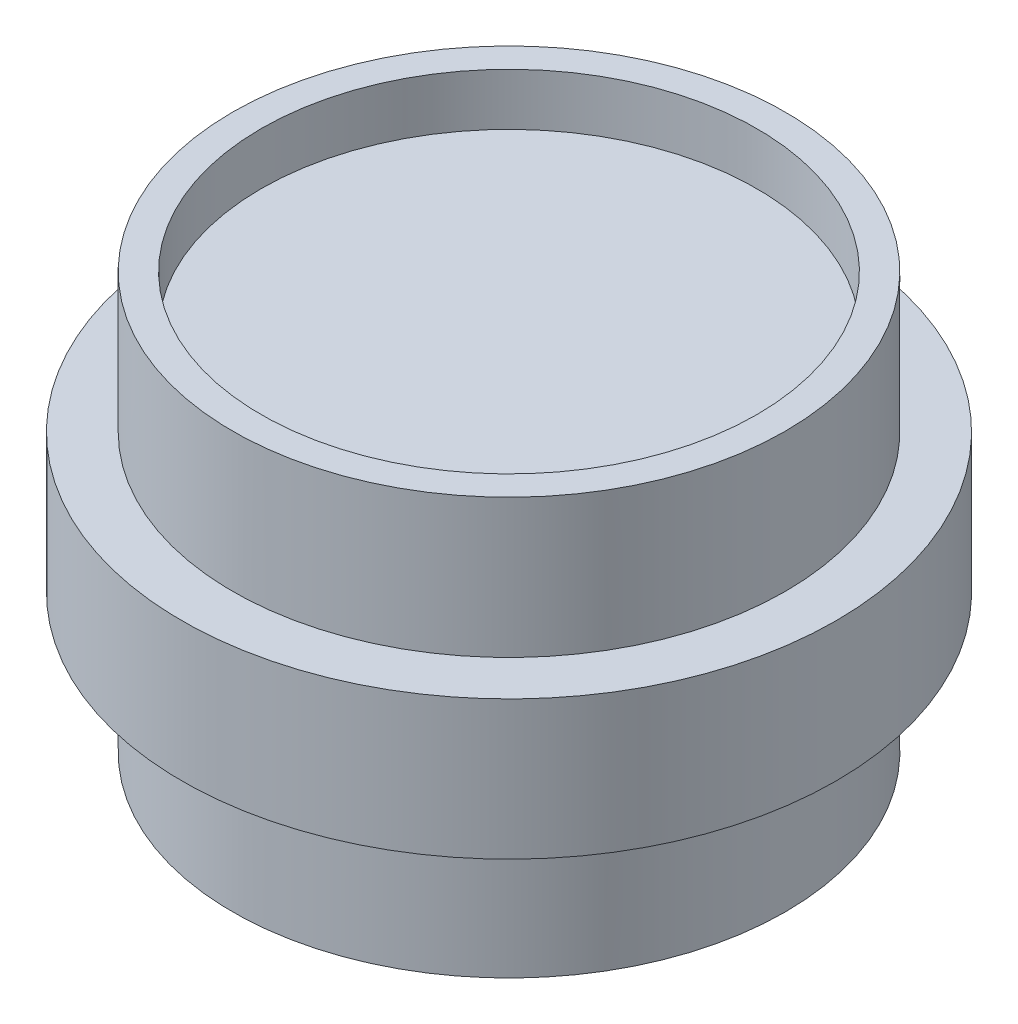
ISO-10303-21;
HEADER;
FILE_DESCRIPTION(('STEP AP214'),'2;1');
FILE_NAME('part.step','',(''),(''),'','','');
FILE_SCHEMA(('AUTOMOTIVE_DESIGN { 1 0 10303 214 1 1 1 1 }'));
ENDSEC;
DATA;
#1=APPLICATION_CONTEXT('core data for automotive mechanical design processes');
#2=APPLICATION_PROTOCOL_DEFINITION('international standard','automotive_design',2000,#1);
#3=PRODUCT_CONTEXT('',#1,'mechanical');
#4=PRODUCT('Part','Part','',(#3));
#5=PRODUCT_RELATED_PRODUCT_CATEGORY('part','',(#4));
#6=PRODUCT_DEFINITION_FORMATION('','',#4);
#7=PRODUCT_DEFINITION_CONTEXT('part definition',#1,'design');
#8=PRODUCT_DEFINITION('design','',#6,#7);
#9=PRODUCT_DEFINITION_SHAPE('','',#8);
#10=(LENGTH_UNIT() NAMED_UNIT(*) SI_UNIT(.MILLI.,.METRE.));
#11=(NAMED_UNIT(*) PLANE_ANGLE_UNIT() SI_UNIT($,.RADIAN.));
#12=(NAMED_UNIT(*) SI_UNIT($,.STERADIAN.) SOLID_ANGLE_UNIT());
#13=UNCERTAINTY_MEASURE_WITH_UNIT(LENGTH_MEASURE(1.E-05),#10,'distance_accuracy_value','');
#14=(GEOMETRIC_REPRESENTATION_CONTEXT(3) GLOBAL_UNCERTAINTY_ASSIGNED_CONTEXT((#13)) GLOBAL_UNIT_ASSIGNED_CONTEXT((#10,
#11,#12)) REPRESENTATION_CONTEXT('',''));
#15=CARTESIAN_POINT('',(0.,0.,0.));
#16=DIRECTION('',(0.,0.,1.));
#17=DIRECTION('',(1.,0.,0.));
#18=AXIS2_PLACEMENT_3D('',#15,#16,#17);
#19=CARTESIAN_POINT('',(0.,-25.4,0.));
#20=DIRECTION('',(0.,-1.,0.));
#21=DIRECTION('',(1.,0.,0.));
#22=AXIS2_PLACEMENT_3D('',#19,#20,#21);
#23=PLANE('',#22);
#24=CARTESIAN_POINT('',(0.,-25.4,0.));
#25=DIRECTION('',(0.,-1.,0.));
#26=DIRECTION('',(1.,0.,0.));
#27=AXIS2_PLACEMENT_3D('',#24,#25,#26);
#28=CIRCLE('',#27,87.1674838557493);
#29=CARTESIAN_POINT('',(-78.6615462449454,-25.4,37.5570417378236));
#30=VERTEX_POINT('',#29);
#31=CARTESIAN_POINT('',(-78.6615462449454,-25.4,-37.5570417378236));
#32=VERTEX_POINT('',#31);
#33=EDGE_CURVE('E364',#30,#32,#28,.T.);
#34=ORIENTED_EDGE('',*,*,#33,.T.);
#35=DIRECTION('',(0.,0.,1.));
#36=VECTOR('',#35,1.);
#37=CARTESIAN_POINT('',(-78.6615462449454,-25.4,0.));
#38=LINE('',#37,#36);
#39=EDGE_CURVE('E405',#32,#30,#38,.T.);
#40=ORIENTED_EDGE('',*,*,#39,.T.);
#41=EDGE_LOOP('',(#34,#40));
#42=FACE_BOUND('',#41,.T.);
#43=ADVANCED_FACE('F16',(#42),#23,.T.);
#44=DIRECTION('',(0.,0.,-1.));
#45=VECTOR('',#44,1.);
#46=CARTESIAN_POINT('',(-40.3711849281472,-25.4,0.));
#47=LINE('',#46,#45);
#48=CARTESIAN_POINT('',(-40.3711849281472,-25.4,-37.5570417378236));
#49=VERTEX_POINT('',#48);
#50=CARTESIAN_POINT('',(-40.3711849281471,-25.4,-77.2550171137102));
#51=VERTEX_POINT('',#50);
#52=EDGE_CURVE('E393',#49,#51,#47,.T.);
#53=ORIENTED_EDGE('',*,*,#52,.F.);
#54=DIRECTION('',(-1.,0.,0.));
#55=VECTOR('',#54,1.);
#56=CARTESIAN_POINT('',(0.,-25.4,-37.5570417378236));
#57=LINE('',#56,#55);
#58=EDGE_CURVE('E206',#49,#32,#57,.T.);
#59=ORIENTED_EDGE('',*,*,#58,.T.);
#60=EDGE_CURVE('E371',#32,#51,#28,.T.);
#61=ORIENTED_EDGE('',*,*,#60,.T.);
#62=EDGE_LOOP('',(#53,#59,#61));
#63=FACE_BOUND('',#62,.T.);
#64=ADVANCED_FACE('F308',(#63),#23,.T.);
#65=CARTESIAN_POINT('',(40.3711849281471,-25.4,-77.2550171137102));
#66=VERTEX_POINT('',#65);
#67=EDGE_CURVE('E376',#51,#66,#28,.T.);
#68=ORIENTED_EDGE('',*,*,#67,.T.);
#69=DIRECTION('',(-1.,0.,0.));
#70=VECTOR('',#69,1.);
#71=CARTESIAN_POINT('',(0.,-25.4,-77.2550171137102));
#72=LINE('',#71,#70);
#73=EDGE_CURVE('E149',#66,#51,#72,.T.);
#74=ORIENTED_EDGE('',*,*,#73,.T.);
#75=EDGE_LOOP('',(#68,#74));
#76=FACE_BOUND('',#75,.T.);
#77=ADVANCED_FACE('F315',(#76),#23,.T.);
#78=CARTESIAN_POINT('',(78.6615462449454,-25.4,-37.5570417378236));
#79=VERTEX_POINT('',#78);
#80=CARTESIAN_POINT('',(40.3711849281472,-25.4,-37.5570417378236));
#81=VERTEX_POINT('',#80);
#82=EDGE_CURVE('E195',#79,#81,#57,.T.);
#83=ORIENTED_EDGE('',*,*,#82,.T.);
#84=DIRECTION('',(0.,0.,-1.));
#85=VECTOR('',#84,1.);
#86=CARTESIAN_POINT('',(40.3711849281472,-25.4,0.));
#87=LINE('',#86,#85);
#88=EDGE_CURVE('E345',#81,#66,#87,.T.);
#89=ORIENTED_EDGE('',*,*,#88,.T.);
#90=EDGE_CURVE('E352',#66,#79,#28,.T.);
#91=ORIENTED_EDGE('',*,*,#90,.T.);
#92=EDGE_LOOP('',(#83,#89,#91));
#93=FACE_BOUND('',#92,.T.);
#94=ADVANCED_FACE('F388',(#93),#23,.T.);
#95=CARTESIAN_POINT('',(-40.3711849281471,-25.4,77.2550171137102));
#96=VERTEX_POINT('',#95);
#97=CARTESIAN_POINT('',(-40.3711849281472,-25.4,37.5570417378236));
#98=VERTEX_POINT('',#97);
#99=EDGE_CURVE('E399',#96,#98,#47,.T.);
#100=ORIENTED_EDGE('',*,*,#99,.F.);
#101=EDGE_CURVE('E359',#96,#30,#28,.T.);
#102=ORIENTED_EDGE('',*,*,#101,.T.);
#103=DIRECTION('',(-1.,0.,0.));
#104=VECTOR('',#103,1.);
#105=CARTESIAN_POINT('',(0.,-25.4,37.5570417378236));
#106=LINE('',#105,#104);
#107=EDGE_CURVE('E347',#98,#30,#106,.T.);
#108=ORIENTED_EDGE('',*,*,#107,.F.);
#109=EDGE_LOOP('',(#100,#102,#108));
#110=FACE_BOUND('',#109,.T.);
#111=ADVANCED_FACE('F340',(#110),#23,.T.);
#112=DIRECTION('',(0.,0.,1.));
#113=VECTOR('',#112,1.);
#114=CARTESIAN_POINT('',(78.6615462449454,-25.4,0.));
#115=LINE('',#114,#113);
#116=CARTESIAN_POINT('',(78.6615462449454,-25.4,37.5570417378236));
#117=VERTEX_POINT('',#116);
#118=EDGE_CURVE('E187',#79,#117,#115,.T.);
#119=ORIENTED_EDGE('',*,*,#118,.F.);
#120=EDGE_CURVE('E255',#79,#117,#28,.T.);
#121=ORIENTED_EDGE('',*,*,#120,.T.);
#122=EDGE_LOOP('',(#119,#121));
#123=FACE_BOUND('',#122,.T.);
#124=ADVANCED_FACE('F334',(#123),#23,.T.);
#125=CARTESIAN_POINT('',(40.3711849281472,-25.4,37.5570417378236));
#126=VERTEX_POINT('',#125);
#127=EDGE_CURVE('E204',#117,#126,#106,.T.);
#128=ORIENTED_EDGE('',*,*,#127,.F.);
#129=CARTESIAN_POINT('',(40.3711849281471,-25.4,77.2550171137102));
#130=VERTEX_POINT('',#129);
#131=EDGE_CURVE('E249',#117,#130,#28,.T.);
#132=ORIENTED_EDGE('',*,*,#131,.T.);
#133=EDGE_CURVE('E38',#130,#126,#87,.T.);
#134=ORIENTED_EDGE('',*,*,#133,.T.);
#135=EDGE_LOOP('',(#128,#132,#134));
#136=FACE_BOUND('',#135,.T.);
#137=ADVANCED_FACE('F324',(#136),#23,.T.);
#138=CARTESIAN_POINT('',(0.,-76.2,0.));
#139=DIRECTION('',(0.,1.,0.));
#140=DIRECTION('',(0.,0.,1.));
#141=AXIS2_PLACEMENT_3D('',#138,#139,#140);
#142=CYLINDRICAL_SURFACE('',#141,101.150613209662);
#143=CARTESIAN_POINT('',(0.,-25.4,0.));
#144=DIRECTION('',(0.,-1.,0.));
#145=DIRECTION('',(0.,0.,-1.));
#146=AXIS2_PLACEMENT_3D('',#143,#144,#145);
#147=CIRCLE('',#146,101.150613209662);
#148=CARTESIAN_POINT('',(0.,-25.4,-101.150613209662));
#149=VERTEX_POINT('',#148);
#150=EDGE_CURVE('E20',#149,#149,#147,.T.);
#151=ORIENTED_EDGE('',*,*,#150,.T.);
#152=EDGE_LOOP('',(#151));
#153=FACE_BOUND('',#152,.T.);
#154=CARTESIAN_POINT('',(0.,-76.2,0.));
#155=DIRECTION('',(0.,-1.,0.));
#156=DIRECTION('',(1.,0.,0.));
#157=AXIS2_PLACEMENT_3D('',#154,#155,#156);
#158=CIRCLE('',#157,101.150613209662);
#159=CARTESIAN_POINT('',(101.150613209662,-76.2,0.));
#160=VERTEX_POINT('',#159);
#161=EDGE_CURVE('E26',#160,#160,#158,.T.);
#162=ORIENTED_EDGE('',*,*,#161,.F.);
#163=EDGE_LOOP('',(#162));
#164=FACE_BOUND('',#163,.T.);
#165=ADVANCED_FACE('F18',(#153,#164),#142,.T.);
#166=CARTESIAN_POINT('',(0.,-76.2,0.));
#167=DIRECTION('',(0.,-1.,0.));
#168=DIRECTION('',(1.,0.,0.));
#169=AXIS2_PLACEMENT_3D('',#166,#167,#168);
#170=PLANE('',#169);
#171=CARTESIAN_POINT('',(0.,-76.2,0.));
#172=DIRECTION('',(0.,-1.,0.));
#173=DIRECTION('',(1.,0.,0.));
#174=AXIS2_PLACEMENT_3D('',#171,#172,#173);
#175=CIRCLE('',#174,87.1674838557493);
#176=CARTESIAN_POINT('',(87.1674838557493,-76.2,0.));
#177=VERTEX_POINT('',#176);
#178=EDGE_CURVE('E245',#177,#177,#175,.T.);
#179=ORIENTED_EDGE('',*,*,#178,.F.);
#180=EDGE_LOOP('',(#179));
#181=FACE_BOUND('',#180,.T.);
#182=ORIENTED_EDGE('',*,*,#161,.T.);
#183=EDGE_LOOP('',(#182));
#184=FACE_BOUND('',#183,.T.);
#185=ADVANCED_FACE('F293',(#181,#184),#170,.T.);
#186=CARTESIAN_POINT('',(0.,-25.4,0.));
#187=DIRECTION('',(0.,1.,0.));
#188=DIRECTION('',(0.,0.,1.));
#189=AXIS2_PLACEMENT_3D('',#186,#187,#188);
#190=CYLINDRICAL_SURFACE('',#189,119.726736982733);
#191=CARTESIAN_POINT('',(0.,-25.4,0.));
#192=DIRECTION('',(0.,-1.,0.));
#193=DIRECTION('',(1.,0.,0.));
#194=AXIS2_PLACEMENT_3D('',#191,#192,#193);
#195=CIRCLE('',#194,119.726736982733);
#196=CARTESIAN_POINT('',(119.726736982733,-25.4,0.));
#197=VERTEX_POINT('',#196);
#198=EDGE_CURVE('E259',#197,#197,#195,.T.);
#199=ORIENTED_EDGE('',*,*,#198,.F.);
#200=EDGE_LOOP('',(#199));
#201=FACE_BOUND('',#200,.T.);
#202=CARTESIAN_POINT('',(0.,25.4,0.));
#203=DIRECTION('',(0.,-1.,0.));
#204=DIRECTION('',(1.,0.,0.));
#205=AXIS2_PLACEMENT_3D('',#202,#203,#204);
#206=CIRCLE('',#205,119.726736982733);
#207=CARTESIAN_POINT('',(119.726736982733,25.4,0.));
#208=VERTEX_POINT('',#207);
#209=EDGE_CURVE('E253',#208,#208,#206,.T.);
#210=ORIENTED_EDGE('',*,*,#209,.T.);
#211=EDGE_LOOP('',(#210));
#212=FACE_BOUND('',#211,.T.);
#213=ADVANCED_FACE('F287',(#201,#212),#190,.T.);
#214=CARTESIAN_POINT('',(0.,-25.4,0.));
#215=DIRECTION('',(0.,-1.,0.));
#216=DIRECTION('',(1.,0.,0.));
#217=AXIS2_PLACEMENT_3D('',#214,#215,#216);
#218=PLANE('',#217);
#219=ORIENTED_EDGE('',*,*,#150,.F.);
#220=EDGE_LOOP('',(#219));
#221=FACE_BOUND('',#220,.T.);
#222=ORIENTED_EDGE('',*,*,#198,.T.);
#223=EDGE_LOOP('',(#222));
#224=FACE_BOUND('',#223,.T.);
#225=ADVANCED_FACE('F283',(#221,#224),#218,.T.);
#226=CARTESIAN_POINT('',(0.,25.4,0.));
#227=DIRECTION('',(0.,-1.,0.));
#228=DIRECTION('',(1.,0.,0.));
#229=AXIS2_PLACEMENT_3D('',#226,#227,#228);
#230=PLANE('',#229);
#231=CARTESIAN_POINT('',(0.,25.4,0.));
#232=DIRECTION('',(0.,-1.,0.));
#233=DIRECTION('',(0.,0.,-1.));
#234=AXIS2_PLACEMENT_3D('',#231,#232,#233);
#235=CIRCLE('',#234,101.150613209662);
#236=CARTESIAN_POINT('',(0.,25.4,-101.150613209662));
#237=VERTEX_POINT('',#236);
#238=EDGE_CURVE('E10',#237,#237,#235,.T.);
#239=ORIENTED_EDGE('',*,*,#238,.T.);
#240=EDGE_LOOP('',(#239));
#241=FACE_BOUND('',#240,.T.);
#242=ORIENTED_EDGE('',*,*,#209,.F.);
#243=EDGE_LOOP('',(#242));
#244=FACE_BOUND('',#243,.T.);
#245=ADVANCED_FACE('F286',(#241,#244),#230,.F.);
#246=CARTESIAN_POINT('',(0.,76.2,0.));
#247=DIRECTION('',(0.,-1.,0.));
#248=DIRECTION('',(1.,0.,0.));
#249=AXIS2_PLACEMENT_3D('',#246,#247,#248);
#250=PLANE('',#249);
#251=CARTESIAN_POINT('',(0.,76.2,0.));
#252=DIRECTION('',(0.,1.,0.));
#253=DIRECTION('',(-1.,0.,0.));
#254=AXIS2_PLACEMENT_3D('',#251,#252,#253);
#255=CIRCLE('',#254,90.7011360194361);
#256=CARTESIAN_POINT('',(-90.7011360194361,76.2,0.));
#257=VERTEX_POINT('',#256);
#258=EDGE_CURVE('E231',#257,#257,#255,.T.);
#259=ORIENTED_EDGE('',*,*,#258,.F.);
#260=EDGE_LOOP('',(#259));
#261=FACE_BOUND('',#260,.T.);
#262=CARTESIAN_POINT('',(0.,76.2,0.));
#263=DIRECTION('',(0.,-1.,0.));
#264=DIRECTION('',(1.,0.,0.));
#265=AXIS2_PLACEMENT_3D('',#262,#263,#264);
#266=CIRCLE('',#265,101.150613209662);
#267=CARTESIAN_POINT('',(101.150613209662,76.2,0.));
#268=VERTEX_POINT('',#267);
#269=EDGE_CURVE('E269',#268,#268,#266,.T.);
#270=ORIENTED_EDGE('',*,*,#269,.F.);
#271=EDGE_LOOP('',(#270));
#272=FACE_BOUND('',#271,.T.);
#273=ADVANCED_FACE('F298',(#261,#272),#250,.F.);
#274=ORIENTED_EDGE('',*,*,#269,.T.);
#275=EDGE_LOOP('',(#274));
#276=FACE_BOUND('',#275,.T.);
#277=ORIENTED_EDGE('',*,*,#238,.F.);
#278=EDGE_LOOP('',(#277));
#279=FACE_BOUND('',#278,.T.);
#280=ADVANCED_FACE('F305',(#276,#279),#142,.T.);
#281=CARTESIAN_POINT('',(0.,-25.4,0.));
#282=DIRECTION('',(0.,-1.,0.));
#283=DIRECTION('',(0.,0.,-1.));
#284=AXIS2_PLACEMENT_3D('',#281,#282,#283);
#285=CYLINDRICAL_SURFACE('',#284,87.1674838557493);
#286=ORIENTED_EDGE('',*,*,#131,.F.);
#287=ORIENTED_EDGE('',*,*,#120,.F.);
#288=ORIENTED_EDGE('',*,*,#90,.F.);
#289=ORIENTED_EDGE('',*,*,#67,.F.);
#290=ORIENTED_EDGE('',*,*,#60,.F.);
#291=ORIENTED_EDGE('',*,*,#33,.F.);
#292=ORIENTED_EDGE('',*,*,#101,.F.);
#293=EDGE_CURVE('E254',#130,#96,#28,.T.);
#294=ORIENTED_EDGE('',*,*,#293,.F.);
#295=EDGE_LOOP('',(#286,#287,#288,#289,#290,#291,#292,#294));
#296=FACE_BOUND('',#295,.T.);
#297=ORIENTED_EDGE('',*,*,#178,.T.);
#298=EDGE_LOOP('',(#297));
#299=FACE_BOUND('',#298,.T.);
#300=ADVANCED_FACE('F322',(#296,#299),#285,.F.);
#301=DIRECTION('',(-1.,0.,0.));
#302=VECTOR('',#301,1.);
#303=CARTESIAN_POINT('',(0.,-25.4,77.2550171137102));
#304=LINE('',#303,#302);
#305=EDGE_CURVE('E395',#130,#96,#304,.T.);
#306=ORIENTED_EDGE('',*,*,#305,.F.);
#307=ORIENTED_EDGE('',*,*,#293,.T.);
#308=EDGE_LOOP('',(#306,#307));
#309=FACE_BOUND('',#308,.T.);
#310=ADVANCED_FACE('F311',(#309),#23,.T.);
#311=CARTESIAN_POINT('',(0.,57.15,0.));
#312=DIRECTION('',(0.,1.,0.));
#313=DIRECTION('',(0.,0.,1.));
#314=AXIS2_PLACEMENT_3D('',#311,#312,#313);
#315=CYLINDRICAL_SURFACE('',#314,90.7011360194361);
#316=CARTESIAN_POINT('',(0.,57.15,0.));
#317=DIRECTION('',(0.,1.,0.));
#318=DIRECTION('',(-1.,0.,0.));
#319=AXIS2_PLACEMENT_3D('',#316,#317,#318);
#320=CIRCLE('',#319,90.7011360194361);
#321=CARTESIAN_POINT('',(-90.7011360194361,57.15,0.));
#322=VERTEX_POINT('',#321);
#323=EDGE_CURVE('E241',#322,#322,#320,.T.);
#324=ORIENTED_EDGE('',*,*,#323,.F.);
#325=EDGE_LOOP('',(#324));
#326=FACE_BOUND('',#325,.T.);
#327=ORIENTED_EDGE('',*,*,#258,.T.);
#328=EDGE_LOOP('',(#327));
#329=FACE_BOUND('',#328,.T.);
#330=ADVANCED_FACE('F321',(#326,#329),#315,.F.);
#331=CARTESIAN_POINT('',(0.,57.15,0.));
#332=DIRECTION('',(0.,1.,0.));
#333=DIRECTION('',(-1.,0.,0.));
#334=AXIS2_PLACEMENT_3D('',#331,#332,#333);
#335=PLANE('',#334);
#336=ORIENTED_EDGE('',*,*,#323,.T.);
#337=EDGE_LOOP('',(#336));
#338=FACE_BOUND('',#337,.T.);
#339=ADVANCED_FACE('F329',(#338),#335,.T.);
#340=CARTESIAN_POINT('',(-40.3711849281472,0.,0.));
#341=DIRECTION('',(-1.,0.,0.));
#342=DIRECTION('',(0.,0.,1.));
#343=AXIS2_PLACEMENT_3D('',#340,#341,#342);
#344=PLANE('',#343);
#345=ORIENTED_EDGE('',*,*,#99,.T.);
#346=DIRECTION('',(0.,-1.,0.));
#347=VECTOR('',#346,1.);
#348=CARTESIAN_POINT('',(-40.3711849281472,0.,37.5570417378236));
#349=LINE('',#348,#347);
#350=CARTESIAN_POINT('',(-40.3711849281472,0.,37.5570417378236));
#351=VERTEX_POINT('',#350);
#352=EDGE_CURVE('E226',#351,#98,#349,.T.);
#353=ORIENTED_EDGE('',*,*,#352,.F.);
#354=DIRECTION('',(0.,0.,-1.));
#355=VECTOR('',#354,1.);
#356=CARTESIAN_POINT('',(-40.3711849281472,0.,0.));
#357=LINE('',#356,#355);
#358=CARTESIAN_POINT('',(-40.3711849281471,0.,77.2550171137102));
#359=VERTEX_POINT('',#358);
#360=EDGE_CURVE('E193',#359,#351,#357,.T.);
#361=ORIENTED_EDGE('',*,*,#360,.F.);
#362=DIRECTION('',(0.,-1.,0.));
#363=VECTOR('',#362,1.);
#364=CARTESIAN_POINT('',(-40.3711849281471,0.,77.2550171137102));
#365=LINE('',#364,#363);
#366=EDGE_CURVE('E232',#359,#96,#365,.T.);
#367=ORIENTED_EDGE('',*,*,#366,.T.);
#368=EDGE_LOOP('',(#345,#353,#361,#367));
#369=FACE_BOUND('',#368,.T.);
#370=ADVANCED_FACE('F466',(#369),#344,.F.);
#371=CARTESIAN_POINT('',(0.,0.,37.5570417378236));
#372=DIRECTION('',(0.,0.,1.));
#373=DIRECTION('',(1.,0.,0.));
#374=AXIS2_PLACEMENT_3D('',#371,#372,#373);
#375=PLANE('',#374);
#376=ORIENTED_EDGE('',*,*,#107,.T.);
#377=DIRECTION('',(0.,-1.,0.));
#378=VECTOR('',#377,1.);
#379=CARTESIAN_POINT('',(-78.6615462449454,0.,37.5570417378236));
#380=LINE('',#379,#378);
#381=CARTESIAN_POINT('',(-78.6615462449454,0.,37.5570417378236));
#382=VERTEX_POINT('',#381);
#383=EDGE_CURVE('E223',#382,#30,#380,.T.);
#384=ORIENTED_EDGE('',*,*,#383,.F.);
#385=DIRECTION('',(-1.,0.,0.));
#386=VECTOR('',#385,1.);
#387=CARTESIAN_POINT('',(0.,0.,37.5570417378236));
#388=LINE('',#387,#386);
#389=EDGE_CURVE('E182',#351,#382,#388,.T.);
#390=ORIENTED_EDGE('',*,*,#389,.F.);
#391=ORIENTED_EDGE('',*,*,#352,.T.);
#392=EDGE_LOOP('',(#376,#384,#390,#391));
#393=FACE_BOUND('',#392,.T.);
#394=ADVANCED_FACE('F453',(#393),#375,.F.);
#395=CARTESIAN_POINT('',(-78.6615462449454,0.,0.));
#396=DIRECTION('',(1.,0.,0.));
#397=DIRECTION('',(0.,0.,-1.));
#398=AXIS2_PLACEMENT_3D('',#395,#396,#397);
#399=PLANE('',#398);
#400=ORIENTED_EDGE('',*,*,#39,.F.);
#401=DIRECTION('',(0.,-1.,0.));
#402=VECTOR('',#401,1.);
#403=CARTESIAN_POINT('',(-78.6615462449454,0.,-37.5570417378236));
#404=LINE('',#403,#402);
#405=CARTESIAN_POINT('',(-78.6615462449454,0.,-37.5570417378236));
#406=VERTEX_POINT('',#405);
#407=EDGE_CURVE('E220',#406,#32,#404,.T.);
#408=ORIENTED_EDGE('',*,*,#407,.F.);
#409=DIRECTION('',(0.,0.,1.));
#410=VECTOR('',#409,1.);
#411=CARTESIAN_POINT('',(-78.6615462449454,0.,0.));
#412=LINE('',#411,#410);
#413=EDGE_CURVE('E418',#406,#382,#412,.T.);
#414=ORIENTED_EDGE('',*,*,#413,.T.);
#415=ORIENTED_EDGE('',*,*,#383,.T.);
#416=EDGE_LOOP('',(#400,#408,#414,#415));
#417=FACE_BOUND('',#416,.T.);
#418=ADVANCED_FACE('F467',(#417),#399,.T.);
#419=CARTESIAN_POINT('',(0.,0.,-37.5570417378236));
#420=DIRECTION('',(0.,0.,1.));
#421=DIRECTION('',(1.,0.,0.));
#422=AXIS2_PLACEMENT_3D('',#419,#420,#421);
#423=PLANE('',#422);
#424=ORIENTED_EDGE('',*,*,#58,.F.);
#425=DIRECTION('',(0.,-1.,0.));
#426=VECTOR('',#425,1.);
#427=CARTESIAN_POINT('',(-40.3711849281472,0.,-37.5570417378236));
#428=LINE('',#427,#426);
#429=CARTESIAN_POINT('',(-40.3711849281472,0.,-37.5570417378236));
#430=VERTEX_POINT('',#429);
#431=EDGE_CURVE('E217',#430,#49,#428,.T.);
#432=ORIENTED_EDGE('',*,*,#431,.F.);
#433=DIRECTION('',(-1.,0.,0.));
#434=VECTOR('',#433,1.);
#435=CARTESIAN_POINT('',(0.,0.,-37.5570417378236));
#436=LINE('',#435,#434);
#437=EDGE_CURVE('E421',#430,#406,#436,.T.);
#438=ORIENTED_EDGE('',*,*,#437,.T.);
#439=ORIENTED_EDGE('',*,*,#407,.T.);
#440=EDGE_LOOP('',(#424,#432,#438,#439));
#441=FACE_BOUND('',#440,.T.);
#442=ADVANCED_FACE('F455',(#441),#423,.T.);
#443=ORIENTED_EDGE('',*,*,#52,.T.);
#444=DIRECTION('',(0.,-1.,0.));
#445=VECTOR('',#444,1.);
#446=CARTESIAN_POINT('',(-40.3711849281471,0.,-77.2550171137102));
#447=LINE('',#446,#445);
#448=CARTESIAN_POINT('',(-40.3711849281471,0.,-77.2550171137102));
#449=VERTEX_POINT('',#448);
#450=EDGE_CURVE('E155',#449,#51,#447,.T.);
#451=ORIENTED_EDGE('',*,*,#450,.F.);
#452=EDGE_CURVE('E168',#430,#449,#357,.T.);
#453=ORIENTED_EDGE('',*,*,#452,.F.);
#454=ORIENTED_EDGE('',*,*,#431,.T.);
#455=EDGE_LOOP('',(#443,#451,#453,#454));
#456=FACE_BOUND('',#455,.T.);
#457=ADVANCED_FACE('F462',(#456),#344,.F.);
#458=CARTESIAN_POINT('',(0.,0.,-77.2550171137102));
#459=DIRECTION('',(0.,0.,1.));
#460=DIRECTION('',(1.,0.,0.));
#461=AXIS2_PLACEMENT_3D('',#458,#459,#460);
#462=PLANE('',#461);
#463=ORIENTED_EDGE('',*,*,#73,.F.);
#464=DIRECTION('',(0.,-1.,0.));
#465=VECTOR('',#464,1.);
#466=CARTESIAN_POINT('',(40.3711849281471,0.,-77.2550171137102));
#467=LINE('',#466,#465);
#468=CARTESIAN_POINT('',(40.3711849281471,0.,-77.2550171137102));
#469=VERTEX_POINT('',#468);
#470=EDGE_CURVE('E144',#469,#66,#467,.T.);
#471=ORIENTED_EDGE('',*,*,#470,.F.);
#472=DIRECTION('',(-1.,0.,0.));
#473=VECTOR('',#472,1.);
#474=CARTESIAN_POINT('',(0.,0.,-77.2550171137102));
#475=LINE('',#474,#473);
#476=EDGE_CURVE('E147',#469,#449,#475,.T.);
#477=ORIENTED_EDGE('',*,*,#476,.T.);
#478=ORIENTED_EDGE('',*,*,#450,.T.);
#479=EDGE_LOOP('',(#463,#471,#477,#478));
#480=FACE_BOUND('',#479,.T.);
#481=ADVANCED_FACE('F146',(#480),#462,.T.);
#482=CARTESIAN_POINT('',(40.3711849281472,0.,0.));
#483=DIRECTION('',(-1.,0.,0.));
#484=DIRECTION('',(0.,0.,1.));
#485=AXIS2_PLACEMENT_3D('',#482,#483,#484);
#486=PLANE('',#485);
#487=ORIENTED_EDGE('',*,*,#88,.F.);
#488=DIRECTION('',(0.,-1.,0.));
#489=VECTOR('',#488,1.);
#490=CARTESIAN_POINT('',(40.3711849281472,0.,-37.5570417378236));
#491=LINE('',#490,#489);
#492=CARTESIAN_POINT('',(40.3711849281472,0.,-37.5570417378236));
#493=VERTEX_POINT('',#492);
#494=EDGE_CURVE('E156',#493,#81,#491,.T.);
#495=ORIENTED_EDGE('',*,*,#494,.F.);
#496=DIRECTION('',(0.,0.,-1.));
#497=VECTOR('',#496,1.);
#498=CARTESIAN_POINT('',(40.3711849281472,0.,0.));
#499=LINE('',#498,#497);
#500=EDGE_CURVE('E164',#493,#469,#499,.T.);
#501=ORIENTED_EDGE('',*,*,#500,.T.);
#502=ORIENTED_EDGE('',*,*,#470,.T.);
#503=EDGE_LOOP('',(#487,#495,#501,#502));
#504=FACE_BOUND('',#503,.T.);
#505=ADVANCED_FACE('F171',(#504),#486,.T.);
#506=ORIENTED_EDGE('',*,*,#82,.F.);
#507=DIRECTION('',(0.,-1.,0.));
#508=VECTOR('',#507,1.);
#509=CARTESIAN_POINT('',(78.6615462449454,0.,-37.5570417378236));
#510=LINE('',#509,#508);
#511=CARTESIAN_POINT('',(78.6615462449454,0.,-37.5570417378236));
#512=VERTEX_POINT('',#511);
#513=EDGE_CURVE('E212',#512,#79,#510,.T.);
#514=ORIENTED_EDGE('',*,*,#513,.F.);
#515=EDGE_CURVE('E180',#512,#493,#436,.T.);
#516=ORIENTED_EDGE('',*,*,#515,.T.);
#517=ORIENTED_EDGE('',*,*,#494,.T.);
#518=EDGE_LOOP('',(#506,#514,#516,#517));
#519=FACE_BOUND('',#518,.T.);
#520=ADVANCED_FACE('F442',(#519),#423,.T.);
#521=CARTESIAN_POINT('',(78.6615462449454,0.,0.));
#522=DIRECTION('',(1.,0.,0.));
#523=DIRECTION('',(0.,0.,-1.));
#524=AXIS2_PLACEMENT_3D('',#521,#522,#523);
#525=PLANE('',#524);
#526=ORIENTED_EDGE('',*,*,#118,.T.);
#527=DIRECTION('',(0.,-1.,0.));
#528=VECTOR('',#527,1.);
#529=CARTESIAN_POINT('',(78.6615462449454,0.,37.5570417378236));
#530=LINE('',#529,#528);
#531=CARTESIAN_POINT('',(78.6615462449454,0.,37.5570417378236));
#532=VERTEX_POINT('',#531);
#533=EDGE_CURVE('E51',#532,#117,#530,.T.);
#534=ORIENTED_EDGE('',*,*,#533,.F.);
#535=DIRECTION('',(0.,0.,1.));
#536=VECTOR('',#535,1.);
#537=CARTESIAN_POINT('',(78.6615462449454,0.,0.));
#538=LINE('',#537,#536);
#539=EDGE_CURVE('E236',#512,#532,#538,.T.);
#540=ORIENTED_EDGE('',*,*,#539,.F.);
#541=ORIENTED_EDGE('',*,*,#513,.T.);
#542=EDGE_LOOP('',(#526,#534,#540,#541));
#543=FACE_BOUND('',#542,.T.);
#544=ADVANCED_FACE('F443',(#543),#525,.F.);
#545=ORIENTED_EDGE('',*,*,#127,.T.);
#546=DIRECTION('',(0.,-1.,0.));
#547=VECTOR('',#546,1.);
#548=CARTESIAN_POINT('',(40.3711849281472,0.,37.5570417378236));
#549=LINE('',#548,#547);
#550=CARTESIAN_POINT('',(40.3711849281472,0.,37.5570417378236));
#551=VERTEX_POINT('',#550);
#552=EDGE_CURVE('E108',#551,#126,#549,.T.);
#553=ORIENTED_EDGE('',*,*,#552,.F.);
#554=EDGE_CURVE('E173',#532,#551,#388,.T.);
#555=ORIENTED_EDGE('',*,*,#554,.F.);
#556=ORIENTED_EDGE('',*,*,#533,.T.);
#557=EDGE_LOOP('',(#545,#553,#555,#556));
#558=FACE_BOUND('',#557,.T.);
#559=ADVANCED_FACE('F445',(#558),#375,.F.);
#560=ORIENTED_EDGE('',*,*,#133,.F.);
#561=DIRECTION('',(0.,-1.,0.));
#562=VECTOR('',#561,1.);
#563=CARTESIAN_POINT('',(40.3711849281471,0.,77.2550171137102));
#564=LINE('',#563,#562);
#565=CARTESIAN_POINT('',(40.3711849281471,0.,77.2550171137102));
#566=VERTEX_POINT('',#565);
#567=EDGE_CURVE('E235',#566,#130,#564,.T.);
#568=ORIENTED_EDGE('',*,*,#567,.F.);
#569=EDGE_CURVE('E175',#566,#551,#499,.T.);
#570=ORIENTED_EDGE('',*,*,#569,.T.);
#571=ORIENTED_EDGE('',*,*,#552,.T.);
#572=EDGE_LOOP('',(#560,#568,#570,#571));
#573=FACE_BOUND('',#572,.T.);
#574=ADVANCED_FACE('F451',(#573),#486,.T.);
#575=CARTESIAN_POINT('',(0.,0.,77.2550171137102));
#576=DIRECTION('',(0.,0.,1.));
#577=DIRECTION('',(1.,0.,0.));
#578=AXIS2_PLACEMENT_3D('',#575,#576,#577);
#579=PLANE('',#578);
#580=ORIENTED_EDGE('',*,*,#305,.T.);
#581=ORIENTED_EDGE('',*,*,#366,.F.);
#582=DIRECTION('',(-1.,0.,0.));
#583=VECTOR('',#582,1.);
#584=CARTESIAN_POINT('',(0.,0.,77.2550171137102));
#585=LINE('',#584,#583);
#586=EDGE_CURVE('E186',#566,#359,#585,.T.);
#587=ORIENTED_EDGE('',*,*,#586,.F.);
#588=ORIENTED_EDGE('',*,*,#567,.T.);
#589=EDGE_LOOP('',(#580,#581,#587,#588));
#590=FACE_BOUND('',#589,.T.);
#591=ADVANCED_FACE('F471',(#590),#579,.F.);
#592=CARTESIAN_POINT('',(0.,0.,0.));
#593=DIRECTION('',(0.,-1.,0.));
#594=DIRECTION('',(1.,0.,0.));
#595=AXIS2_PLACEMENT_3D('',#592,#593,#594);
#596=PLANE('',#595);
#597=ORIENTED_EDGE('',*,*,#360,.T.);
#598=ORIENTED_EDGE('',*,*,#389,.T.);
#599=ORIENTED_EDGE('',*,*,#413,.F.);
#600=ORIENTED_EDGE('',*,*,#437,.F.);
#601=ORIENTED_EDGE('',*,*,#452,.T.);
#602=ORIENTED_EDGE('',*,*,#476,.F.);
#603=ORIENTED_EDGE('',*,*,#500,.F.);
#604=ORIENTED_EDGE('',*,*,#515,.F.);
#605=ORIENTED_EDGE('',*,*,#539,.T.);
#606=ORIENTED_EDGE('',*,*,#554,.T.);
#607=ORIENTED_EDGE('',*,*,#569,.F.);
#608=ORIENTED_EDGE('',*,*,#586,.T.);
#609=EDGE_LOOP('',(#597,#598,#599,#600,#601,#602,#603,#604,#605,#606,#607,#608));
#610=FACE_BOUND('',#609,.T.);
#611=ADVANCED_FACE('F162',(#610),#596,.T.);
#612=CLOSED_SHELL('',(#43,#64,#77,#94,#111,#124,#137,#165,#185,#213,#225,#245,#273,#280,#300,
#310,#330,#339,#370,#394,#418,#442,#457,#481,#505,#520,#544,#559,#574,#591,#611));
#613=MANIFOLD_SOLID_BREP('B1',#612);
#614=ADVANCED_BREP_SHAPE_REPRESENTATION('',(#18,#613),#14);
#615=SHAPE_DEFINITION_REPRESENTATION(#9,#614);
ENDSEC;
END-ISO-10303-21;
